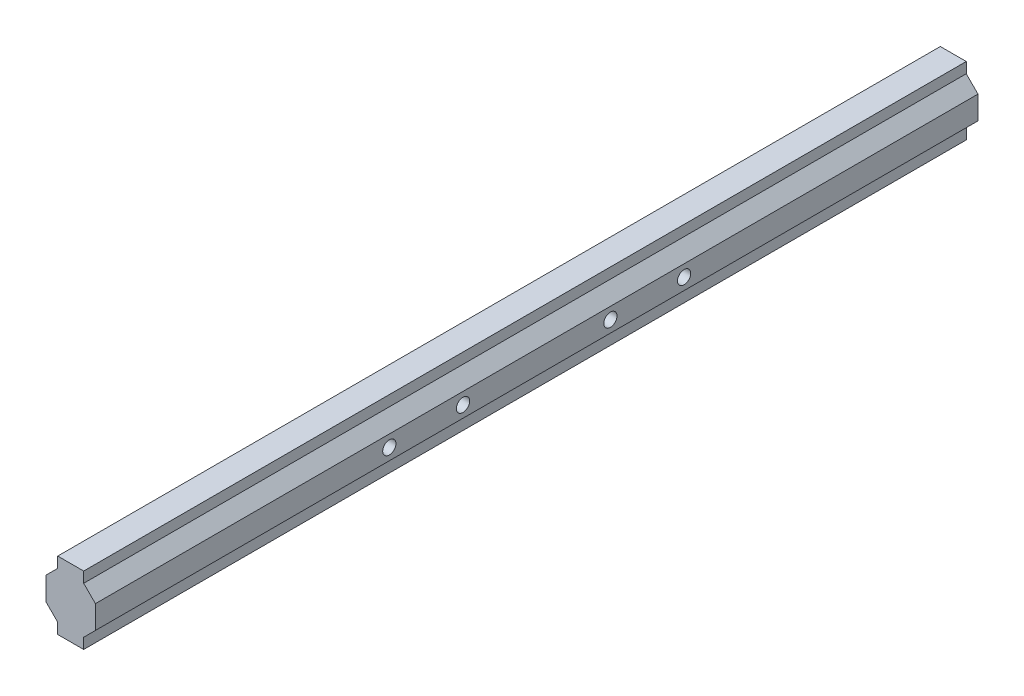
ISO-10303-21;
HEADER;
FILE_DESCRIPTION(('STEP AP214'),'2;1');
FILE_NAME('part.step','',(''),(''),'','','');
FILE_SCHEMA(('AUTOMOTIVE_DESIGN { 1 0 10303 214 1 1 1 1 }'));
ENDSEC;
DATA;
#1=APPLICATION_CONTEXT('core data for automotive mechanical design processes');
#2=APPLICATION_PROTOCOL_DEFINITION('international standard','automotive_design',2000,#1);
#3=PRODUCT_CONTEXT('',#1,'mechanical');
#4=PRODUCT('Part','Part','',(#3));
#5=PRODUCT_RELATED_PRODUCT_CATEGORY('part','',(#4));
#6=PRODUCT_DEFINITION_FORMATION('','',#4);
#7=PRODUCT_DEFINITION_CONTEXT('part definition',#1,'design');
#8=PRODUCT_DEFINITION('design','',#6,#7);
#9=PRODUCT_DEFINITION_SHAPE('','',#8);
#10=(LENGTH_UNIT() NAMED_UNIT(*) SI_UNIT(.MILLI.,.METRE.));
#11=(NAMED_UNIT(*) PLANE_ANGLE_UNIT() SI_UNIT($,.RADIAN.));
#12=(NAMED_UNIT(*) SI_UNIT($,.STERADIAN.) SOLID_ANGLE_UNIT());
#13=UNCERTAINTY_MEASURE_WITH_UNIT(LENGTH_MEASURE(1.E-05),#10,'distance_accuracy_value','');
#14=(GEOMETRIC_REPRESENTATION_CONTEXT(3) GLOBAL_UNCERTAINTY_ASSIGNED_CONTEXT((#13)) GLOBAL_UNIT_ASSIGNED_CONTEXT((#10,
#11,#12)) REPRESENTATION_CONTEXT('',''));
#15=CARTESIAN_POINT('',(0.,0.,0.));
#16=DIRECTION('',(0.,0.,1.));
#17=DIRECTION('',(1.,0.,0.));
#18=AXIS2_PLACEMENT_3D('',#15,#16,#17);
#19=CARTESIAN_POINT('',(-39.550290087148,0.0297695452971111,316.106580091162));
#20=DIRECTION('',(1.,0.,0.));
#21=DIRECTION('',(0.,0.,-1.));
#22=AXIS2_PLACEMENT_3D('',#19,#20,#21);
#23=PLANE('',#22);
#24=CARTESIAN_POINT('',(-39.550290087148,2.66200259233075,182.706580091162));
#25=DIRECTION('',(1.,0.,0.));
#26=DIRECTION('',(0.,0.,-1.));
#27=AXIS2_PLACEMENT_3D('',#24,#25,#26);
#28=CIRCLE('',#27,1.50000000000003);
#29=CARTESIAN_POINT('',(-39.550290087148,2.66200259233075,181.206580091161));
#30=VERTEX_POINT('',#29);
#31=EDGE_CURVE('E168',#30,#30,#28,.T.);
#32=ORIENTED_EDGE('',*,*,#31,.T.);
#33=EDGE_LOOP('',(#32));
#34=FACE_BOUND('',#33,.T.);
#35=CARTESIAN_POINT('',(-39.550290087148,2.66200259233075,199.406580091162));
#36=DIRECTION('',(1.,0.,0.));
#37=DIRECTION('',(0.,0.,-1.));
#38=AXIS2_PLACEMENT_3D('',#35,#36,#37);
#39=CIRCLE('',#38,1.50000000000003);
#40=CARTESIAN_POINT('',(-39.550290087148,2.66200259233075,197.906580091161));
#41=VERTEX_POINT('',#40);
#42=EDGE_CURVE('E305',#41,#41,#39,.T.);
#43=ORIENTED_EDGE('',*,*,#42,.T.);
#44=EDGE_LOOP('',(#43));
#45=FACE_BOUND('',#44,.T.);
#46=CARTESIAN_POINT('',(-39.550290087148,2.66200259233074,249.506580091162));
#47=DIRECTION('',(1.,0.,0.));
#48=DIRECTION('',(0.,0.,-1.));
#49=AXIS2_PLACEMENT_3D('',#46,#47,#48);
#50=CIRCLE('',#49,1.50000000000003);
#51=CARTESIAN_POINT('',(-39.550290087148,2.66200259233074,248.006580091161));
#52=VERTEX_POINT('',#51);
#53=EDGE_CURVE('E309',#52,#52,#50,.T.);
#54=ORIENTED_EDGE('',*,*,#53,.T.);
#55=EDGE_LOOP('',(#54));
#56=FACE_BOUND('',#55,.T.);
#57=CARTESIAN_POINT('',(-39.550290087148,2.66200259233074,232.806580091162));
#58=DIRECTION('',(1.,0.,0.));
#59=DIRECTION('',(0.,0.,-1.));
#60=AXIS2_PLACEMENT_3D('',#57,#58,#59);
#61=CIRCLE('',#60,1.50000000000003);
#62=CARTESIAN_POINT('',(-39.550290087148,2.66200259233074,231.306580091161));
#63=VERTEX_POINT('',#62);
#64=EDGE_CURVE('E312',#63,#63,#61,.T.);
#65=ORIENTED_EDGE('',*,*,#64,.T.);
#66=EDGE_LOOP('',(#65));
#67=FACE_BOUND('',#66,.T.);
#68=DIRECTION('',(0.,-1.,0.));
#69=VECTOR('',#68,1.);
#70=CARTESIAN_POINT('',(-39.550290087148,0.0297695452971111,116.106580091162));
#71=LINE('',#70,#69);
#72=CARTESIAN_POINT('',(-39.550290087148,5.29423563936438,116.106580091162));
#73=VERTEX_POINT('',#72);
#74=CARTESIAN_POINT('',(-39.550290087148,0.0297695452971111,116.106580091162));
#75=VERTEX_POINT('',#74);
#76=EDGE_CURVE('E163',#73,#75,#71,.T.);
#77=ORIENTED_EDGE('',*,*,#76,.T.);
#78=DIRECTION('',(0.,0.,-1.));
#79=VECTOR('',#78,1.);
#80=CARTESIAN_POINT('',(-39.550290087148,0.0297695452971111,316.106580091162));
#81=LINE('',#80,#79);
#82=CARTESIAN_POINT('',(-39.550290087148,0.0297695452971111,316.106580091162));
#83=VERTEX_POINT('',#82);
#84=EDGE_CURVE('E11',#83,#75,#81,.T.);
#85=ORIENTED_EDGE('',*,*,#84,.F.);
#86=DIRECTION('',(0.,-1.,0.));
#87=VECTOR('',#86,1.);
#88=CARTESIAN_POINT('',(-39.550290087148,0.0297695452971111,316.106580091162));
#89=LINE('',#88,#87);
#90=CARTESIAN_POINT('',(-39.550290087148,5.29423563936438,316.106580091162));
#91=VERTEX_POINT('',#90);
#92=EDGE_CURVE('E198',#91,#83,#89,.T.);
#93=ORIENTED_EDGE('',*,*,#92,.F.);
#94=DIRECTION('',(0.,0.,-1.));
#95=VECTOR('',#94,1.);
#96=CARTESIAN_POINT('',(-39.550290087148,5.29423563936438,316.106580091162));
#97=LINE('',#96,#95);
#98=EDGE_CURVE('E159',#91,#73,#97,.T.);
#99=ORIENTED_EDGE('',*,*,#98,.T.);
#100=EDGE_LOOP('',(#77,#85,#93,#99));
#101=FACE_BOUND('',#100,.T.);
#102=ADVANCED_FACE('F38',(#34,#45,#56,#67,#101),#23,.F.);
#103=CARTESIAN_POINT('',(-36.8896299153682,-2.63089062648271,316.106580091162));
#104=DIRECTION('',(0.707106781186547,0.707106781186547,0.));
#105=DIRECTION('',(-0.707106781186548,0.707106781186548,0.));
#106=AXIS2_PLACEMENT_3D('',#103,#104,#105);
#107=PLANE('',#106);
#108=DIRECTION('',(0.707106781186547,-0.707106781186547,0.));
#109=VECTOR('',#108,1.);
#110=CARTESIAN_POINT('',(-36.8896299153682,-2.63089062648271,116.106580091162));
#111=LINE('',#110,#109);
#112=CARTESIAN_POINT('',(-36.8896299153682,-2.63089062648271,116.106580091162));
#113=VERTEX_POINT('',#112);
#114=EDGE_CURVE('E167',#75,#113,#111,.T.);
#115=ORIENTED_EDGE('',*,*,#114,.T.);
#116=DIRECTION('',(0.,0.,-1.));
#117=VECTOR('',#116,1.);
#118=CARTESIAN_POINT('',(-36.8896299153682,-2.63089062648271,316.106580091162));
#119=LINE('',#118,#117);
#120=CARTESIAN_POINT('',(-36.8896299153682,-2.63089062648271,316.106580091162));
#121=VERTEX_POINT('',#120);
#122=EDGE_CURVE('E47',#121,#113,#119,.T.);
#123=ORIENTED_EDGE('',*,*,#122,.F.);
#124=DIRECTION('',(0.707106781186547,-0.707106781186547,0.));
#125=VECTOR('',#124,1.);
#126=CARTESIAN_POINT('',(-36.8896299153682,-2.63089062648271,316.106580091162));
#127=LINE('',#126,#125);
#128=EDGE_CURVE('E110',#83,#121,#127,.T.);
#129=ORIENTED_EDGE('',*,*,#128,.F.);
#130=ORIENTED_EDGE('',*,*,#84,.T.);
#131=EDGE_LOOP('',(#115,#123,#129,#130));
#132=FACE_BOUND('',#131,.T.);
#133=ADVANCED_FACE('F292',(#132),#107,.F.);
#134=CARTESIAN_POINT('',(-36.8896299153682,-5.03799740766926,316.106580091162));
#135=DIRECTION('',(1.,0.,0.));
#136=DIRECTION('',(0.,0.,-1.));
#137=AXIS2_PLACEMENT_3D('',#134,#135,#136);
#138=PLANE('',#137);
#139=DIRECTION('',(0.,-1.,0.));
#140=VECTOR('',#139,1.);
#141=CARTESIAN_POINT('',(-36.8896299153682,-5.03799740766926,116.106580091162));
#142=LINE('',#141,#140);
#143=CARTESIAN_POINT('',(-36.8896299153682,-5.03799740766926,116.106580091162));
#144=VERTEX_POINT('',#143);
#145=EDGE_CURVE('E171',#113,#144,#142,.T.);
#146=ORIENTED_EDGE('',*,*,#145,.T.);
#147=DIRECTION('',(0.,0.,-1.));
#148=VECTOR('',#147,1.);
#149=CARTESIAN_POINT('',(-36.8896299153682,-5.03799740766926,316.106580091162));
#150=LINE('',#149,#148);
#151=CARTESIAN_POINT('',(-36.8896299153682,-5.03799740766926,316.106580091162));
#152=VERTEX_POINT('',#151);
#153=EDGE_CURVE('E225',#152,#144,#150,.T.);
#154=ORIENTED_EDGE('',*,*,#153,.F.);
#155=DIRECTION('',(0.,-1.,0.));
#156=VECTOR('',#155,1.);
#157=CARTESIAN_POINT('',(-36.8896299153682,-5.03799740766926,316.106580091162));
#158=LINE('',#157,#156);
#159=EDGE_CURVE('E235',#121,#152,#158,.T.);
#160=ORIENTED_EDGE('',*,*,#159,.F.);
#161=ORIENTED_EDGE('',*,*,#122,.T.);
#162=EDGE_LOOP('',(#146,#154,#160,#161));
#163=FACE_BOUND('',#162,.T.);
#164=ADVANCED_FACE('F233',(#163),#138,.F.);
#165=CARTESIAN_POINT('',(-31.0109502589278,-5.03799740766925,316.106580091162));
#166=DIRECTION('',(0.,1.,0.));
#167=DIRECTION('',(-1.,0.,0.));
#168=AXIS2_PLACEMENT_3D('',#165,#166,#167);
#169=PLANE('',#168);
#170=DIRECTION('',(1.,0.,0.));
#171=VECTOR('',#170,1.);
#172=CARTESIAN_POINT('',(-31.0109502589278,-5.03799740766925,116.106580091162));
#173=LINE('',#172,#171);
#174=CARTESIAN_POINT('',(-31.0109502589278,-5.03799740766925,116.106580091162));
#175=VERTEX_POINT('',#174);
#176=EDGE_CURVE('E174',#144,#175,#173,.T.);
#177=ORIENTED_EDGE('',*,*,#176,.T.);
#178=DIRECTION('',(0.,0.,-1.));
#179=VECTOR('',#178,1.);
#180=CARTESIAN_POINT('',(-31.0109502589278,-5.03799740766925,316.106580091162));
#181=LINE('',#180,#179);
#182=CARTESIAN_POINT('',(-31.0109502589278,-5.03799740766925,316.106580091162));
#183=VERTEX_POINT('',#182);
#184=EDGE_CURVE('E221',#183,#175,#181,.T.);
#185=ORIENTED_EDGE('',*,*,#184,.F.);
#186=DIRECTION('',(1.,0.,0.));
#187=VECTOR('',#186,1.);
#188=CARTESIAN_POINT('',(-31.0109502589278,-5.03799740766925,316.106580091162));
#189=LINE('',#188,#187);
#190=EDGE_CURVE('E254',#152,#183,#189,.T.);
#191=ORIENTED_EDGE('',*,*,#190,.F.);
#192=ORIENTED_EDGE('',*,*,#153,.T.);
#193=EDGE_LOOP('',(#177,#185,#191,#192));
#194=FACE_BOUND('',#193,.T.);
#195=ADVANCED_FACE('F244',(#194),#169,.F.);
#196=CARTESIAN_POINT('',(-31.0109502589278,-2.63089062648273,316.106580091162));
#197=DIRECTION('',(-1.,0.,0.));
#198=DIRECTION('',(0.,0.,1.));
#199=AXIS2_PLACEMENT_3D('',#196,#197,#198);
#200=PLANE('',#199);
#201=DIRECTION('',(0.,1.,0.));
#202=VECTOR('',#201,1.);
#203=CARTESIAN_POINT('',(-31.0109502589278,-2.63089062648273,116.106580091162));
#204=LINE('',#203,#202);
#205=CARTESIAN_POINT('',(-31.0109502589278,-2.63089062648273,116.106580091162));
#206=VERTEX_POINT('',#205);
#207=EDGE_CURVE('E177',#175,#206,#204,.T.);
#208=ORIENTED_EDGE('',*,*,#207,.T.);
#209=DIRECTION('',(0.,0.,-1.));
#210=VECTOR('',#209,1.);
#211=CARTESIAN_POINT('',(-31.0109502589278,-2.63089062648273,316.106580091162));
#212=LINE('',#211,#210);
#213=CARTESIAN_POINT('',(-31.0109502589278,-2.63089062648273,316.106580091162));
#214=VERTEX_POINT('',#213);
#215=EDGE_CURVE('E217',#214,#206,#212,.T.);
#216=ORIENTED_EDGE('',*,*,#215,.F.);
#217=DIRECTION('',(0.,1.,0.));
#218=VECTOR('',#217,1.);
#219=CARTESIAN_POINT('',(-31.0109502589278,-2.63089062648273,316.106580091162));
#220=LINE('',#219,#218);
#221=EDGE_CURVE('E250',#183,#214,#220,.T.);
#222=ORIENTED_EDGE('',*,*,#221,.F.);
#223=ORIENTED_EDGE('',*,*,#184,.T.);
#224=EDGE_LOOP('',(#208,#216,#222,#223));
#225=FACE_BOUND('',#224,.T.);
#226=ADVANCED_FACE('F248',(#225),#200,.F.);
#227=CARTESIAN_POINT('',(-28.350290087148,0.0297695452971137,316.106580091162));
#228=DIRECTION('',(-0.707106781186548,0.707106781186548,0.));
#229=DIRECTION('',(-0.707106781186548,-0.707106781186548,0.));
#230=AXIS2_PLACEMENT_3D('',#227,#228,#229);
#231=PLANE('',#230);
#232=DIRECTION('',(0.707106781186548,0.707106781186548,0.));
#233=VECTOR('',#232,1.);
#234=CARTESIAN_POINT('',(-28.350290087148,0.0297695452971137,116.106580091162));
#235=LINE('',#234,#233);
#236=CARTESIAN_POINT('',(-28.350290087148,0.0297695452971137,116.106580091162));
#237=VERTEX_POINT('',#236);
#238=EDGE_CURVE('E180',#206,#237,#235,.T.);
#239=ORIENTED_EDGE('',*,*,#238,.T.);
#240=DIRECTION('',(0.,0.,-1.));
#241=VECTOR('',#240,1.);
#242=CARTESIAN_POINT('',(-28.350290087148,0.0297695452971137,316.106580091162));
#243=LINE('',#242,#241);
#244=CARTESIAN_POINT('',(-28.350290087148,0.0297695452971137,316.106580091162));
#245=VERTEX_POINT('',#244);
#246=EDGE_CURVE('E213',#245,#237,#243,.T.);
#247=ORIENTED_EDGE('',*,*,#246,.F.);
#248=DIRECTION('',(0.707106781186548,0.707106781186548,0.));
#249=VECTOR('',#248,1.);
#250=CARTESIAN_POINT('',(-28.350290087148,0.0297695452971137,316.106580091162));
#251=LINE('',#250,#249);
#252=EDGE_CURVE('E253',#214,#245,#251,.T.);
#253=ORIENTED_EDGE('',*,*,#252,.F.);
#254=ORIENTED_EDGE('',*,*,#215,.T.);
#255=EDGE_LOOP('',(#239,#247,#253,#254));
#256=FACE_BOUND('',#255,.T.);
#257=ADVANCED_FACE('F350',(#256),#231,.F.);
#258=CARTESIAN_POINT('',(-28.350290087148,5.29423563936437,316.106580091162));
#259=DIRECTION('',(-1.,0.,0.));
#260=DIRECTION('',(0.,0.,1.));
#261=AXIS2_PLACEMENT_3D('',#258,#259,#260);
#262=PLANE('',#261);
#263=CARTESIAN_POINT('',(-28.350290087148,2.66200259233075,182.706580091162));
#264=DIRECTION('',(1.,0.,0.));
#265=DIRECTION('',(0.,0.,1.));
#266=AXIS2_PLACEMENT_3D('',#263,#264,#265);
#267=CIRCLE('',#266,1.50000000000003);
#268=CARTESIAN_POINT('',(-28.350290087148,2.66200259233075,184.206580091162));
#269=VERTEX_POINT('',#268);
#270=EDGE_CURVE('E333',#269,#269,#267,.T.);
#271=ORIENTED_EDGE('',*,*,#270,.F.);
#272=EDGE_LOOP('',(#271));
#273=FACE_BOUND('',#272,.T.);
#274=CARTESIAN_POINT('',(-28.350290087148,2.66200259233075,199.406580091162));
#275=DIRECTION('',(1.,0.,0.));
#276=DIRECTION('',(0.,0.,1.));
#277=AXIS2_PLACEMENT_3D('',#274,#275,#276);
#278=CIRCLE('',#277,1.50000000000003);
#279=CARTESIAN_POINT('',(-28.350290087148,2.66200259233075,200.906580091162));
#280=VERTEX_POINT('',#279);
#281=EDGE_CURVE('E337',#280,#280,#278,.T.);
#282=ORIENTED_EDGE('',*,*,#281,.F.);
#283=EDGE_LOOP('',(#282));
#284=FACE_BOUND('',#283,.T.);
#285=CARTESIAN_POINT('',(-28.350290087148,2.66200259233074,249.506580091162));
#286=DIRECTION('',(1.,0.,0.));
#287=DIRECTION('',(0.,0.,-1.));
#288=AXIS2_PLACEMENT_3D('',#285,#286,#287);
#289=CIRCLE('',#288,1.50000000000003);
#290=CARTESIAN_POINT('',(-28.350290087148,2.66200259233074,248.006580091161));
#291=VERTEX_POINT('',#290);
#292=EDGE_CURVE('E321',#291,#291,#289,.T.);
#293=ORIENTED_EDGE('',*,*,#292,.F.);
#294=EDGE_LOOP('',(#293));
#295=FACE_BOUND('',#294,.T.);
#296=CARTESIAN_POINT('',(-28.350290087148,2.66200259233074,232.806580091162));
#297=DIRECTION('',(1.,0.,0.));
#298=DIRECTION('',(0.,0.,-1.));
#299=AXIS2_PLACEMENT_3D('',#296,#297,#298);
#300=CIRCLE('',#299,1.50000000000003);
#301=CARTESIAN_POINT('',(-28.350290087148,2.66200259233074,231.306580091161));
#302=VERTEX_POINT('',#301);
#303=EDGE_CURVE('E315',#302,#302,#300,.T.);
#304=ORIENTED_EDGE('',*,*,#303,.F.);
#305=EDGE_LOOP('',(#304));
#306=FACE_BOUND('',#305,.T.);
#307=DIRECTION('',(0.,1.,0.));
#308=VECTOR('',#307,1.);
#309=CARTESIAN_POINT('',(-28.350290087148,5.29423563936437,116.106580091162));
#310=LINE('',#309,#308);
#311=CARTESIAN_POINT('',(-28.350290087148,5.29423563936437,116.106580091162));
#312=VERTEX_POINT('',#311);
#313=EDGE_CURVE('E183',#237,#312,#310,.T.);
#314=ORIENTED_EDGE('',*,*,#313,.T.);
#315=DIRECTION('',(0.,0.,-1.));
#316=VECTOR('',#315,1.);
#317=CARTESIAN_POINT('',(-28.350290087148,5.29423563936437,316.106580091162));
#318=LINE('',#317,#316);
#319=CARTESIAN_POINT('',(-28.350290087148,5.29423563936437,316.106580091162));
#320=VERTEX_POINT('',#319);
#321=EDGE_CURVE('E209',#320,#312,#318,.T.);
#322=ORIENTED_EDGE('',*,*,#321,.F.);
#323=DIRECTION('',(0.,1.,0.));
#324=VECTOR('',#323,1.);
#325=CARTESIAN_POINT('',(-28.350290087148,5.29423563936437,316.106580091162));
#326=LINE('',#325,#324);
#327=EDGE_CURVE('E258',#245,#320,#326,.T.);
#328=ORIENTED_EDGE('',*,*,#327,.F.);
#329=ORIENTED_EDGE('',*,*,#246,.T.);
#330=EDGE_LOOP('',(#314,#322,#328,#329));
#331=FACE_BOUND('',#330,.T.);
#332=ADVANCED_FACE('F348',(#273,#284,#295,#306,#331),#262,.F.);
#333=CARTESIAN_POINT('',(-31.0109502589278,7.95489581114419,316.106580091162));
#334=DIRECTION('',(-0.707106781186547,-0.707106781186547,0.));
#335=DIRECTION('',(0.707106781186548,-0.707106781186548,0.));
#336=AXIS2_PLACEMENT_3D('',#333,#334,#335);
#337=PLANE('',#336);
#338=DIRECTION('',(-0.707106781186547,0.707106781186547,0.));
#339=VECTOR('',#338,1.);
#340=CARTESIAN_POINT('',(-31.0109502589278,7.95489581114419,116.106580091162));
#341=LINE('',#340,#339);
#342=CARTESIAN_POINT('',(-31.0109502589278,7.95489581114419,116.106580091162));
#343=VERTEX_POINT('',#342);
#344=EDGE_CURVE('E186',#312,#343,#341,.T.);
#345=ORIENTED_EDGE('',*,*,#344,.T.);
#346=DIRECTION('',(0.,0.,-1.));
#347=VECTOR('',#346,1.);
#348=CARTESIAN_POINT('',(-31.0109502589278,7.95489581114419,316.106580091162));
#349=LINE('',#348,#347);
#350=CARTESIAN_POINT('',(-31.0109502589278,7.95489581114419,316.106580091162));
#351=VERTEX_POINT('',#350);
#352=EDGE_CURVE('E205',#351,#343,#349,.T.);
#353=ORIENTED_EDGE('',*,*,#352,.F.);
#354=DIRECTION('',(-0.707106781186547,0.707106781186547,0.));
#355=VECTOR('',#354,1.);
#356=CARTESIAN_POINT('',(-31.0109502589278,7.95489581114419,316.106580091162));
#357=LINE('',#356,#355);
#358=EDGE_CURVE('E265',#320,#351,#357,.T.);
#359=ORIENTED_EDGE('',*,*,#358,.F.);
#360=ORIENTED_EDGE('',*,*,#321,.T.);
#361=EDGE_LOOP('',(#345,#353,#359,#360));
#362=FACE_BOUND('',#361,.T.);
#363=ADVANCED_FACE('F273',(#362),#337,.F.);
#364=CARTESIAN_POINT('',(-31.0109502589278,10.3620025923307,316.106580091162));
#365=DIRECTION('',(-1.,0.,0.));
#366=DIRECTION('',(0.,0.,1.));
#367=AXIS2_PLACEMENT_3D('',#364,#365,#366);
#368=PLANE('',#367);
#369=DIRECTION('',(0.,1.,0.));
#370=VECTOR('',#369,1.);
#371=CARTESIAN_POINT('',(-31.0109502589278,10.3620025923307,116.106580091162));
#372=LINE('',#371,#370);
#373=CARTESIAN_POINT('',(-31.0109502589278,10.3620025923307,116.106580091162));
#374=VERTEX_POINT('',#373);
#375=EDGE_CURVE('E189',#343,#374,#372,.T.);
#376=ORIENTED_EDGE('',*,*,#375,.T.);
#377=DIRECTION('',(0.,0.,-1.));
#378=VECTOR('',#377,1.);
#379=CARTESIAN_POINT('',(-31.0109502589278,10.3620025923307,316.106580091162));
#380=LINE('',#379,#378);
#381=CARTESIAN_POINT('',(-31.0109502589278,10.3620025923307,316.106580091162));
#382=VERTEX_POINT('',#381);
#383=EDGE_CURVE('E152',#382,#374,#380,.T.);
#384=ORIENTED_EDGE('',*,*,#383,.F.);
#385=DIRECTION('',(0.,1.,0.));
#386=VECTOR('',#385,1.);
#387=CARTESIAN_POINT('',(-31.0109502589278,10.3620025923307,316.106580091162));
#388=LINE('',#387,#386);
#389=EDGE_CURVE('E141',#351,#382,#388,.T.);
#390=ORIENTED_EDGE('',*,*,#389,.F.);
#391=ORIENTED_EDGE('',*,*,#352,.T.);
#392=EDGE_LOOP('',(#376,#384,#390,#391));
#393=FACE_BOUND('',#392,.T.);
#394=ADVANCED_FACE('F277',(#393),#368,.F.);
#395=CARTESIAN_POINT('',(-36.8896299153682,10.3620025923307,316.106580091162));
#396=DIRECTION('',(0.,-1.,0.));
#397=DIRECTION('',(0.,0.,-1.));
#398=AXIS2_PLACEMENT_3D('',#395,#396,#397);
#399=PLANE('',#398);
#400=DIRECTION('',(-1.,0.,0.));
#401=VECTOR('',#400,1.);
#402=CARTESIAN_POINT('',(-36.8896299153682,10.3620025923307,116.106580091162));
#403=LINE('',#402,#401);
#404=CARTESIAN_POINT('',(-36.8896299153682,10.3620025923307,116.106580091162));
#405=VERTEX_POINT('',#404);
#406=EDGE_CURVE('E150',#374,#405,#403,.T.);
#407=ORIENTED_EDGE('',*,*,#406,.T.);
#408=DIRECTION('',(0.,0.,-1.));
#409=VECTOR('',#408,1.);
#410=CARTESIAN_POINT('',(-36.8896299153682,10.3620025923307,316.106580091162));
#411=LINE('',#410,#409);
#412=CARTESIAN_POINT('',(-36.8896299153682,10.3620025923307,316.106580091162));
#413=VERTEX_POINT('',#412);
#414=EDGE_CURVE('E147',#413,#405,#411,.T.);
#415=ORIENTED_EDGE('',*,*,#414,.F.);
#416=DIRECTION('',(-1.,0.,0.));
#417=VECTOR('',#416,1.);
#418=CARTESIAN_POINT('',(-36.8896299153682,10.3620025923307,316.106580091162));
#419=LINE('',#418,#417);
#420=EDGE_CURVE('E135',#382,#413,#419,.T.);
#421=ORIENTED_EDGE('',*,*,#420,.F.);
#422=ORIENTED_EDGE('',*,*,#383,.T.);
#423=EDGE_LOOP('',(#407,#415,#421,#422));
#424=FACE_BOUND('',#423,.T.);
#425=ADVANCED_FACE('F148',(#424),#399,.F.);
#426=CARTESIAN_POINT('',(-36.8896299153682,7.9548958111442,316.106580091162));
#427=DIRECTION('',(1.,0.,0.));
#428=DIRECTION('',(0.,0.,-1.));
#429=AXIS2_PLACEMENT_3D('',#426,#427,#428);
#430=PLANE('',#429);
#431=DIRECTION('',(0.,-1.,0.));
#432=VECTOR('',#431,1.);
#433=CARTESIAN_POINT('',(-36.8896299153682,7.9548958111442,116.106580091162));
#434=LINE('',#433,#432);
#435=CARTESIAN_POINT('',(-36.8896299153682,7.9548958111442,116.106580091162));
#436=VERTEX_POINT('',#435);
#437=EDGE_CURVE('E96',#405,#436,#434,.T.);
#438=ORIENTED_EDGE('',*,*,#437,.T.);
#439=DIRECTION('',(0.,0.,-1.));
#440=VECTOR('',#439,1.);
#441=CARTESIAN_POINT('',(-36.8896299153682,7.9548958111442,316.106580091162));
#442=LINE('',#441,#440);
#443=CARTESIAN_POINT('',(-36.8896299153682,7.9548958111442,316.106580091162));
#444=VERTEX_POINT('',#443);
#445=EDGE_CURVE('E153',#444,#436,#442,.T.);
#446=ORIENTED_EDGE('',*,*,#445,.F.);
#447=DIRECTION('',(0.,-1.,0.));
#448=VECTOR('',#447,1.);
#449=CARTESIAN_POINT('',(-36.8896299153682,7.9548958111442,316.106580091162));
#450=LINE('',#449,#448);
#451=EDGE_CURVE('E139',#413,#444,#450,.T.);
#452=ORIENTED_EDGE('',*,*,#451,.F.);
#453=ORIENTED_EDGE('',*,*,#414,.T.);
#454=EDGE_LOOP('',(#438,#446,#452,#453));
#455=FACE_BOUND('',#454,.T.);
#456=ADVANCED_FACE('F155',(#455),#430,.F.);
#457=CARTESIAN_POINT('',(-39.550290087148,5.29423563936438,316.106580091162));
#458=DIRECTION('',(0.707106781186547,-0.707106781186547,0.));
#459=DIRECTION('',(0.707106781186548,0.707106781186548,0.));
#460=AXIS2_PLACEMENT_3D('',#457,#458,#459);
#461=PLANE('',#460);
#462=DIRECTION('',(-0.707106781186547,-0.707106781186547,0.));
#463=VECTOR('',#462,1.);
#464=CARTESIAN_POINT('',(-39.550290087148,5.29423563936438,116.106580091162));
#465=LINE('',#464,#463);
#466=EDGE_CURVE('E102',#436,#73,#465,.T.);
#467=ORIENTED_EDGE('',*,*,#466,.T.);
#468=ORIENTED_EDGE('',*,*,#98,.F.);
#469=DIRECTION('',(-0.707106781186547,-0.707106781186547,0.));
#470=VECTOR('',#469,1.);
#471=CARTESIAN_POINT('',(-39.550290087148,5.29423563936438,316.106580091162));
#472=LINE('',#471,#470);
#473=EDGE_CURVE('E55',#444,#91,#472,.T.);
#474=ORIENTED_EDGE('',*,*,#473,.F.);
#475=ORIENTED_EDGE('',*,*,#445,.T.);
#476=EDGE_LOOP('',(#467,#468,#474,#475));
#477=FACE_BOUND('',#476,.T.);
#478=ADVANCED_FACE('F281',(#477),#461,.F.);
#479=CARTESIAN_POINT('',(0.,0.,316.106580091162));
#480=DIRECTION('',(0.,0.,-1.));
#481=DIRECTION('',(-1.,0.,0.));
#482=AXIS2_PLACEMENT_3D('',#479,#480,#481);
#483=PLANE('',#482);
#484=ORIENTED_EDGE('',*,*,#92,.T.);
#485=ORIENTED_EDGE('',*,*,#128,.T.);
#486=ORIENTED_EDGE('',*,*,#159,.T.);
#487=ORIENTED_EDGE('',*,*,#190,.T.);
#488=ORIENTED_EDGE('',*,*,#221,.T.);
#489=ORIENTED_EDGE('',*,*,#252,.T.);
#490=ORIENTED_EDGE('',*,*,#327,.T.);
#491=ORIENTED_EDGE('',*,*,#358,.T.);
#492=ORIENTED_EDGE('',*,*,#389,.T.);
#493=ORIENTED_EDGE('',*,*,#420,.T.);
#494=ORIENTED_EDGE('',*,*,#451,.T.);
#495=ORIENTED_EDGE('',*,*,#473,.T.);
#496=EDGE_LOOP('',(#484,#485,#486,#487,#488,#489,#490,#491,#492,#493,#494,#495));
#497=FACE_BOUND('',#496,.T.);
#498=ADVANCED_FACE('F137',(#497),#483,.F.);
#499=CARTESIAN_POINT('',(0.,0.,116.106580091162));
#500=DIRECTION('',(0.,0.,-1.));
#501=DIRECTION('',(-1.,0.,0.));
#502=AXIS2_PLACEMENT_3D('',#499,#500,#501);
#503=PLANE('',#502);
#504=ORIENTED_EDGE('',*,*,#76,.F.);
#505=ORIENTED_EDGE('',*,*,#466,.F.);
#506=ORIENTED_EDGE('',*,*,#437,.F.);
#507=ORIENTED_EDGE('',*,*,#406,.F.);
#508=ORIENTED_EDGE('',*,*,#375,.F.);
#509=ORIENTED_EDGE('',*,*,#344,.F.);
#510=ORIENTED_EDGE('',*,*,#313,.F.);
#511=ORIENTED_EDGE('',*,*,#238,.F.);
#512=ORIENTED_EDGE('',*,*,#207,.F.);
#513=ORIENTED_EDGE('',*,*,#176,.F.);
#514=ORIENTED_EDGE('',*,*,#145,.F.);
#515=ORIENTED_EDGE('',*,*,#114,.F.);
#516=EDGE_LOOP('',(#504,#505,#506,#507,#508,#509,#510,#511,#512,#513,#514,#515));
#517=FACE_BOUND('',#516,.T.);
#518=ADVANCED_FACE('F239',(#517),#503,.T.);
#519=CARTESIAN_POINT('',(-48.350290087148,2.66200259233074,232.806580091162));
#520=DIRECTION('',(1.,0.,0.));
#521=DIRECTION('',(0.,0.,-1.));
#522=AXIS2_PLACEMENT_3D('',#519,#520,#521);
#523=CYLINDRICAL_SURFACE('',#522,1.50000000000003);
#524=ORIENTED_EDGE('',*,*,#303,.T.);
#525=EDGE_LOOP('',(#524));
#526=FACE_BOUND('',#525,.T.);
#527=ORIENTED_EDGE('',*,*,#64,.F.);
#528=EDGE_LOOP('',(#527));
#529=FACE_BOUND('',#528,.T.);
#530=ADVANCED_FACE('F433',(#526,#529),#523,.F.);
#531=CARTESIAN_POINT('',(-48.350290087148,2.66200259233074,249.506580091162));
#532=DIRECTION('',(1.,0.,0.));
#533=DIRECTION('',(0.,0.,-1.));
#534=AXIS2_PLACEMENT_3D('',#531,#532,#533);
#535=CYLINDRICAL_SURFACE('',#534,1.50000000000003);
#536=ORIENTED_EDGE('',*,*,#292,.T.);
#537=EDGE_LOOP('',(#536));
#538=FACE_BOUND('',#537,.T.);
#539=ORIENTED_EDGE('',*,*,#53,.F.);
#540=EDGE_LOOP('',(#539));
#541=FACE_BOUND('',#540,.T.);
#542=ADVANCED_FACE('F345',(#538,#541),#535,.F.);
#543=CARTESIAN_POINT('',(-48.350290087148,2.66200259233075,199.406580091162));
#544=DIRECTION('',(1.,0.,0.));
#545=DIRECTION('',(0.,0.,-1.));
#546=AXIS2_PLACEMENT_3D('',#543,#544,#545);
#547=CYLINDRICAL_SURFACE('',#546,1.50000000000003);
#548=ORIENTED_EDGE('',*,*,#281,.T.);
#549=EDGE_LOOP('',(#548));
#550=FACE_BOUND('',#549,.T.);
#551=ORIENTED_EDGE('',*,*,#42,.F.);
#552=EDGE_LOOP('',(#551));
#553=FACE_BOUND('',#552,.T.);
#554=ADVANCED_FACE('F448',(#550,#553),#547,.F.);
#555=CARTESIAN_POINT('',(-48.350290087148,2.66200259233075,182.706580091162));
#556=DIRECTION('',(1.,0.,0.));
#557=DIRECTION('',(0.,0.,-1.));
#558=AXIS2_PLACEMENT_3D('',#555,#556,#557);
#559=CYLINDRICAL_SURFACE('',#558,1.50000000000003);
#560=ORIENTED_EDGE('',*,*,#270,.T.);
#561=EDGE_LOOP('',(#560));
#562=FACE_BOUND('',#561,.T.);
#563=ORIENTED_EDGE('',*,*,#31,.F.);
#564=EDGE_LOOP('',(#563));
#565=FACE_BOUND('',#564,.T.);
#566=ADVANCED_FACE('F455',(#562,#565),#559,.F.);
#567=CLOSED_SHELL('',(#102,#133,#164,#195,#226,#257,#332,#363,#394,#425,#456,#478,#498,#518,
#530,#542,#554,#566));
#568=MANIFOLD_SOLID_BREP('B2',#567);
#569=ADVANCED_BREP_SHAPE_REPRESENTATION('',(#18,#568),#14);
#570=SHAPE_DEFINITION_REPRESENTATION(#9,#569);
ENDSEC;
END-ISO-10303-21;
